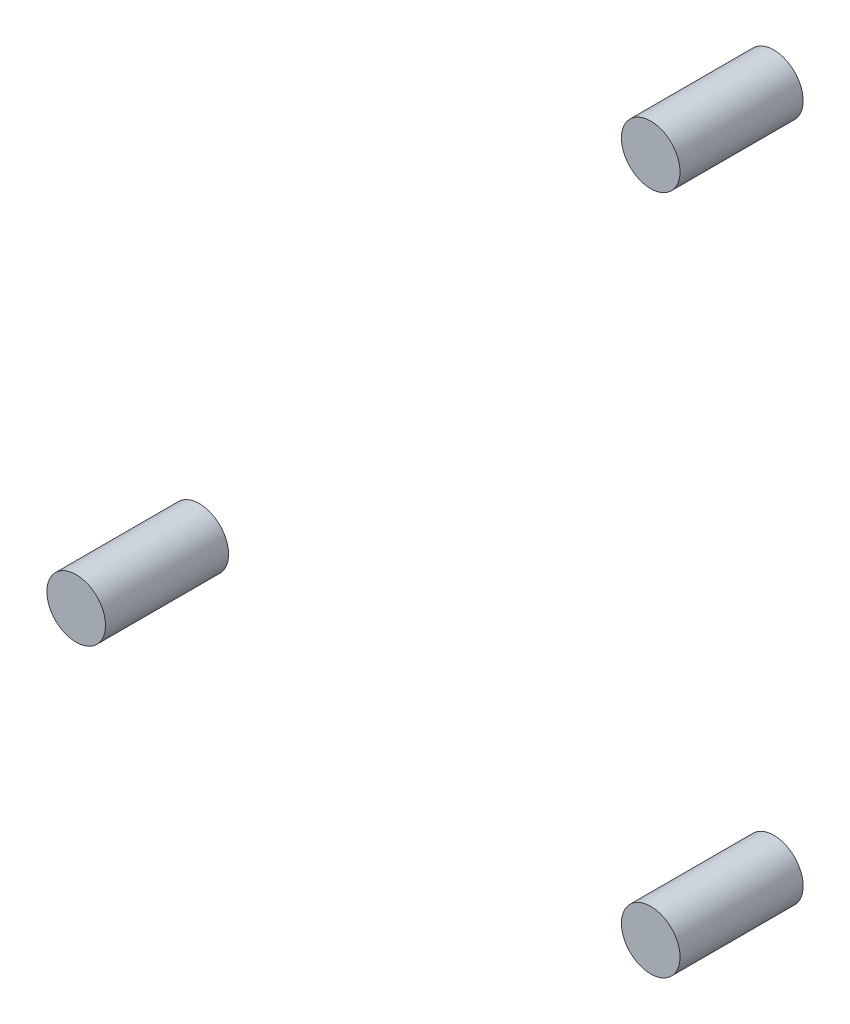
ISO-10303-21;
HEADER;
FILE_DESCRIPTION(('STEP AP214'),'2;1');
FILE_NAME('part.step','',(''),(''),'','','');
FILE_SCHEMA(('AUTOMOTIVE_DESIGN { 1 0 10303 214 1 1 1 1 }'));
ENDSEC;
DATA;
#1=APPLICATION_CONTEXT('core data for automotive mechanical design processes');
#2=APPLICATION_PROTOCOL_DEFINITION('international standard','automotive_design',2000,#1);
#3=PRODUCT_CONTEXT('',#1,'mechanical');
#4=PRODUCT('Part','Part','',(#3));
#5=PRODUCT_RELATED_PRODUCT_CATEGORY('part','',(#4));
#6=PRODUCT_DEFINITION_FORMATION('','',#4);
#7=PRODUCT_DEFINITION_CONTEXT('part definition',#1,'design');
#8=PRODUCT_DEFINITION('design','',#6,#7);
#9=PRODUCT_DEFINITION_SHAPE('','',#8);
#10=(LENGTH_UNIT() NAMED_UNIT(*) SI_UNIT(.MILLI.,.METRE.));
#11=(NAMED_UNIT(*) PLANE_ANGLE_UNIT() SI_UNIT($,.RADIAN.));
#12=(NAMED_UNIT(*) SI_UNIT($,.STERADIAN.) SOLID_ANGLE_UNIT());
#13=UNCERTAINTY_MEASURE_WITH_UNIT(LENGTH_MEASURE(1.E-05),#10,'distance_accuracy_value','');
#14=(GEOMETRIC_REPRESENTATION_CONTEXT(3) GLOBAL_UNCERTAINTY_ASSIGNED_CONTEXT((#13)) GLOBAL_UNIT_ASSIGNED_CONTEXT((#10,
#11,#12)) REPRESENTATION_CONTEXT('',''));
#15=CARTESIAN_POINT('',(0.,0.,0.));
#16=DIRECTION('',(0.,0.,1.));
#17=DIRECTION('',(1.,0.,0.));
#18=AXIS2_PLACEMENT_3D('',#15,#16,#17);
#19=CARTESIAN_POINT('',(86.395999908447,250.90899658203,17.5710686062331));
#20=DIRECTION('',(0.,0.,-1.));
#21=DIRECTION('',(-1.,0.,0.));
#22=AXIS2_PLACEMENT_3D('',#19,#20,#21);
#23=CYLINDRICAL_SURFACE('',#22,2.5);
#24=CARTESIAN_POINT('',(86.395999908447,250.90899658203,0.));
#25=DIRECTION('',(0.,0.,1.));
#26=DIRECTION('',(1.,0.,0.));
#27=AXIS2_PLACEMENT_3D('',#24,#25,#26);
#28=CIRCLE('',#27,2.5);
#29=CARTESIAN_POINT('',(88.895999908447,250.90899658203,0.));
#30=VERTEX_POINT('',#29);
#31=EDGE_CURVE('E47',#30,#30,#28,.T.);
#32=ORIENTED_EDGE('',*,*,#31,.T.);
#33=EDGE_LOOP('',(#32));
#34=FACE_BOUND('',#33,.T.);
#35=CARTESIAN_POINT('',(86.395999908447,250.90899658203,10.5000007943676));
#36=DIRECTION('',(0.,0.,1.));
#37=DIRECTION('',(0.,-1.,0.));
#38=AXIS2_PLACEMENT_3D('',#35,#36,#37);
#39=CIRCLE('',#38,2.5);
#40=CARTESIAN_POINT('',(86.395999908447,248.40899658203,10.5000007943676));
#41=VERTEX_POINT('',#40);
#42=EDGE_CURVE('E11',#41,#41,#39,.T.);
#43=ORIENTED_EDGE('',*,*,#42,.F.);
#44=EDGE_LOOP('',(#43));
#45=FACE_BOUND('',#44,.T.);
#46=ADVANCED_FACE('F40',(#34,#45),#23,.T.);
#47=CARTESIAN_POINT('',(86.395999908447,250.90899658203,0.));
#48=DIRECTION('',(0.,0.,1.));
#49=DIRECTION('',(1.,0.,0.));
#50=AXIS2_PLACEMENT_3D('',#47,#48,#49);
#51=PLANE('',#50);
#52=ORIENTED_EDGE('',*,*,#31,.F.);
#53=EDGE_LOOP('',(#52));
#54=FACE_BOUND('',#53,.T.);
#55=ADVANCED_FACE('F55',(#54),#51,.F.);
#56=CARTESIAN_POINT('',(61.895999908447,211.90899658203,10.5000007943676));
#57=DIRECTION('',(0.,0.,1.));
#58=DIRECTION('',(0.,-1.,0.));
#59=AXIS2_PLACEMENT_3D('',#56,#57,#58);
#60=PLANE('',#59);
#61=ORIENTED_EDGE('',*,*,#42,.T.);
#62=EDGE_LOOP('',(#61));
#63=FACE_BOUND('',#62,.T.);
#64=ADVANCED_FACE('F42',(#63),#60,.T.);
#65=CLOSED_SHELL('',(#46,#55,#64));
#66=MANIFOLD_SOLID_BREP('B2',#65);
#67=CARTESIAN_POINT('',(86.395999908447,192.90899658203,17.5710686062331));
#68=DIRECTION('',(0.,0.,-1.));
#69=DIRECTION('',(-1.,0.,0.));
#70=AXIS2_PLACEMENT_3D('',#67,#68,#69);
#71=CYLINDRICAL_SURFACE('',#70,2.5);
#72=CARTESIAN_POINT('',(86.395999908447,192.90899658203,0.));
#73=DIRECTION('',(0.,0.,1.));
#74=DIRECTION('',(1.,0.,0.));
#75=AXIS2_PLACEMENT_3D('',#72,#73,#74);
#76=CIRCLE('',#75,2.5);
#77=CARTESIAN_POINT('',(88.895999908447,192.90899658203,0.));
#78=VERTEX_POINT('',#77);
#79=EDGE_CURVE('E95',#78,#78,#76,.T.);
#80=ORIENTED_EDGE('',*,*,#79,.T.);
#81=EDGE_LOOP('',(#80));
#82=FACE_BOUND('',#81,.T.);
#83=CARTESIAN_POINT('',(86.395999908447,192.90899658203,10.5000007943676));
#84=DIRECTION('',(0.,0.,1.));
#85=DIRECTION('',(0.,-1.,0.));
#86=AXIS2_PLACEMENT_3D('',#83,#84,#85);
#87=CIRCLE('',#86,2.5);
#88=CARTESIAN_POINT('',(86.395999908447,190.40899658203,10.5000007943676));
#89=VERTEX_POINT('',#88);
#90=EDGE_CURVE('E39',#89,#89,#87,.T.);
#91=ORIENTED_EDGE('',*,*,#90,.F.);
#92=EDGE_LOOP('',(#91));
#93=FACE_BOUND('',#92,.T.);
#94=ADVANCED_FACE('F88',(#82,#93),#71,.T.);
#95=CARTESIAN_POINT('',(86.395999908447,192.90899658203,0.));
#96=DIRECTION('',(0.,0.,1.));
#97=DIRECTION('',(1.,0.,0.));
#98=AXIS2_PLACEMENT_3D('',#95,#96,#97);
#99=PLANE('',#98);
#100=ORIENTED_EDGE('',*,*,#79,.F.);
#101=EDGE_LOOP('',(#100));
#102=FACE_BOUND('',#101,.T.);
#103=ADVANCED_FACE('F103',(#102),#99,.F.);
#104=CARTESIAN_POINT('',(61.895999908447,211.90899658203,10.5000007943676));
#105=DIRECTION('',(0.,0.,1.));
#106=DIRECTION('',(0.,-1.,0.));
#107=AXIS2_PLACEMENT_3D('',#104,#105,#106);
#108=PLANE('',#107);
#109=ORIENTED_EDGE('',*,*,#90,.T.);
#110=EDGE_LOOP('',(#109));
#111=FACE_BOUND('',#110,.T.);
#112=ADVANCED_FACE('F90',(#111),#108,.T.);
#113=CLOSED_SHELL('',(#94,#103,#112));
#114=MANIFOLD_SOLID_BREP('B6',#113);
#115=CARTESIAN_POINT('',(37.395999908447,192.90899658203,17.5710686062331));
#116=DIRECTION('',(0.,0.,-1.));
#117=DIRECTION('',(-1.,0.,0.));
#118=AXIS2_PLACEMENT_3D('',#115,#116,#117);
#119=CYLINDRICAL_SURFACE('',#118,2.5);
#120=CARTESIAN_POINT('',(37.395999908447,192.90899658203,0.));
#121=DIRECTION('',(0.,0.,1.));
#122=DIRECTION('',(1.,0.,0.));
#123=AXIS2_PLACEMENT_3D('',#120,#121,#122);
#124=CIRCLE('',#123,2.5);
#125=CARTESIAN_POINT('',(39.895999908447,192.90899658203,0.));
#126=VERTEX_POINT('',#125);
#127=EDGE_CURVE('E136',#126,#126,#124,.T.);
#128=ORIENTED_EDGE('',*,*,#127,.T.);
#129=EDGE_LOOP('',(#128));
#130=FACE_BOUND('',#129,.T.);
#131=CARTESIAN_POINT('',(37.395999908447,192.90899658203,10.5000007943676));
#132=DIRECTION('',(0.,0.,1.));
#133=DIRECTION('',(0.,-1.,0.));
#134=AXIS2_PLACEMENT_3D('',#131,#132,#133);
#135=CIRCLE('',#134,2.5);
#136=CARTESIAN_POINT('',(37.395999908447,190.40899658203,10.5000007943676));
#137=VERTEX_POINT('',#136);
#138=EDGE_CURVE('E87',#137,#137,#135,.T.);
#139=ORIENTED_EDGE('',*,*,#138,.F.);
#140=EDGE_LOOP('',(#139));
#141=FACE_BOUND('',#140,.T.);
#142=ADVANCED_FACE('F129',(#130,#141),#119,.T.);
#143=CARTESIAN_POINT('',(37.395999908447,192.90899658203,0.));
#144=DIRECTION('',(0.,0.,1.));
#145=DIRECTION('',(1.,0.,0.));
#146=AXIS2_PLACEMENT_3D('',#143,#144,#145);
#147=PLANE('',#146);
#148=ORIENTED_EDGE('',*,*,#127,.F.);
#149=EDGE_LOOP('',(#148));
#150=FACE_BOUND('',#149,.T.);
#151=ADVANCED_FACE('F144',(#150),#147,.F.);
#152=CARTESIAN_POINT('',(61.895999908447,211.90899658203,10.5000007943676));
#153=DIRECTION('',(0.,0.,1.));
#154=DIRECTION('',(0.,-1.,0.));
#155=AXIS2_PLACEMENT_3D('',#152,#153,#154);
#156=PLANE('',#155);
#157=ORIENTED_EDGE('',*,*,#138,.T.);
#158=EDGE_LOOP('',(#157));
#159=FACE_BOUND('',#158,.T.);
#160=ADVANCED_FACE('F131',(#159),#156,.T.);
#161=CLOSED_SHELL('',(#142,#151,#160));
#162=MANIFOLD_SOLID_BREP('B34',#161);
#163=ADVANCED_BREP_SHAPE_REPRESENTATION('',(#18,#66,#114,#162),#14);
#164=SHAPE_DEFINITION_REPRESENTATION(#9,#163);
ENDSEC;
END-ISO-10303-21;
